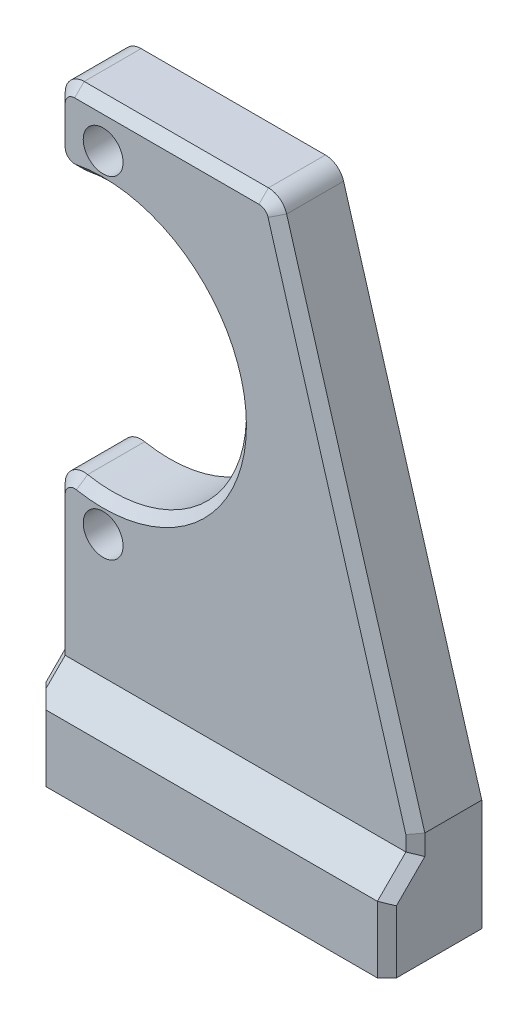
ISO-10303-21;
HEADER;
FILE_DESCRIPTION(('STEP AP214'),'2;1');
FILE_NAME('part.step','',(''),(''),'','','');
FILE_SCHEMA(('AUTOMOTIVE_DESIGN { 1 0 10303 214 1 1 1 1 }'));
ENDSEC;
DATA;
#1=APPLICATION_CONTEXT('core data for automotive mechanical design processes');
#2=APPLICATION_PROTOCOL_DEFINITION('international standard','automotive_design',2000,#1);
#3=PRODUCT_CONTEXT('',#1,'mechanical');
#4=PRODUCT('Part','Part','',(#3));
#5=PRODUCT_RELATED_PRODUCT_CATEGORY('part','',(#4));
#6=PRODUCT_DEFINITION_FORMATION('','',#4);
#7=PRODUCT_DEFINITION_CONTEXT('part definition',#1,'design');
#8=PRODUCT_DEFINITION('design','',#6,#7);
#9=PRODUCT_DEFINITION_SHAPE('','',#8);
#10=(LENGTH_UNIT() NAMED_UNIT(*) SI_UNIT(.MILLI.,.METRE.));
#11=(NAMED_UNIT(*) PLANE_ANGLE_UNIT() SI_UNIT($,.RADIAN.));
#12=(NAMED_UNIT(*) SI_UNIT($,.STERADIAN.) SOLID_ANGLE_UNIT());
#13=UNCERTAINTY_MEASURE_WITH_UNIT(LENGTH_MEASURE(1.E-05),#10,'distance_accuracy_value','');
#14=(GEOMETRIC_REPRESENTATION_CONTEXT(3) GLOBAL_UNCERTAINTY_ASSIGNED_CONTEXT((#13)) GLOBAL_UNIT_ASSIGNED_CONTEXT((#10,
#11,#12)) REPRESENTATION_CONTEXT('',''));
#15=CARTESIAN_POINT('',(0.,0.,0.));
#16=DIRECTION('',(0.,0.,1.));
#17=DIRECTION('',(1.,0.,0.));
#18=AXIS2_PLACEMENT_3D('',#15,#16,#17);
#19=CARTESIAN_POINT('',(-13.0887811558611,62.3706180274269,10.));
#20=DIRECTION('',(0.,-1.,0.));
#21=DIRECTION('',(0.,0.,-1.));
#22=AXIS2_PLACEMENT_3D('',#19,#20,#21);
#23=PLANE('',#22);
#24=DIRECTION('',(0.,0.,-1.));
#25=VECTOR('',#24,1.);
#26=CARTESIAN_POINT('',(-11.0887811558611,62.3706180274269,10.));
#27=LINE('',#26,#25);
#28=CARTESIAN_POINT('',(-11.0887811558611,62.3706180274269,0.));
#29=VERTEX_POINT('',#28);
#30=CARTESIAN_POINT('',(-11.0887811558611,62.3706180274269,6.));
#31=VERTEX_POINT('',#30);
#32=EDGE_CURVE('E238',#29,#31,#27,.F.);
#33=ORIENTED_EDGE('',*,*,#32,.T.);
#34=DIRECTION('',(1.,0.,0.));
#35=VECTOR('',#34,1.);
#36=CARTESIAN_POINT('',(8.33058138017552,62.3706180274269,6.));
#37=LINE('',#36,#35);
#38=CARTESIAN_POINT('',(8.33058138017552,62.3706180274269,6.));
#39=VERTEX_POINT('',#38);
#40=EDGE_CURVE('E303',#31,#39,#37,.T.);
#41=ORIENTED_EDGE('',*,*,#40,.T.);
#42=DIRECTION('',(0.,0.,-1.));
#43=VECTOR('',#42,1.);
#44=CARTESIAN_POINT('',(8.33058138017552,62.3706180274269,10.));
#45=LINE('',#44,#43);
#46=CARTESIAN_POINT('',(8.33058138017552,62.3706180274269,0.));
#47=VERTEX_POINT('',#46);
#48=EDGE_CURVE('E236',#39,#47,#45,.T.);
#49=ORIENTED_EDGE('',*,*,#48,.T.);
#50=DIRECTION('',(-1.,0.,0.));
#51=VECTOR('',#50,1.);
#52=CARTESIAN_POINT('',(-13.0887811558611,62.3706180274269,0.));
#53=LINE('',#52,#51);
#54=EDGE_CURVE('E432',#47,#29,#53,.T.);
#55=ORIENTED_EDGE('',*,*,#54,.T.);
#56=EDGE_LOOP('',(#33,#41,#49,#55));
#57=FACE_BOUND('',#56,.T.);
#58=ADVANCED_FACE('F34',(#57),#23,.F.);
#59=CARTESIAN_POINT('',(-13.0887811558611,53.715647776757,10.));
#60=DIRECTION('',(1.,0.,0.));
#61=DIRECTION('',(0.,1.,0.));
#62=AXIS2_PLACEMENT_3D('',#59,#60,#61);
#63=PLANE('',#62);
#64=DIRECTION('',(0.,0.,-1.));
#65=VECTOR('',#64,1.);
#66=CARTESIAN_POINT('',(-13.0887811558611,56.349973406966,10.));
#67=LINE('',#66,#65);
#68=CARTESIAN_POINT('',(-13.0887811558611,56.349973406966,0.));
#69=VERTEX_POINT('',#68);
#70=CARTESIAN_POINT('',(-13.0887811558611,56.349973406966,6.));
#71=VERTEX_POINT('',#70);
#72=EDGE_CURVE('E223',#69,#71,#67,.F.);
#73=ORIENTED_EDGE('',*,*,#72,.T.);
#74=DIRECTION('',(0.,1.,0.));
#75=VECTOR('',#74,1.);
#76=CARTESIAN_POINT('',(-13.0887811558611,60.3706180274269,6.));
#77=LINE('',#76,#75);
#78=CARTESIAN_POINT('',(-13.0887811558611,60.3706180274269,6.));
#79=VERTEX_POINT('',#78);
#80=EDGE_CURVE('E297',#71,#79,#77,.T.);
#81=ORIENTED_EDGE('',*,*,#80,.T.);
#82=DIRECTION('',(0.,0.,-1.));
#83=VECTOR('',#82,1.);
#84=CARTESIAN_POINT('',(-13.0887811558611,60.3706180274269,10.));
#85=LINE('',#84,#83);
#86=CARTESIAN_POINT('',(-13.0887811558611,60.3706180274269,0.));
#87=VERTEX_POINT('',#86);
#88=EDGE_CURVE('E226',#79,#87,#85,.T.);
#89=ORIENTED_EDGE('',*,*,#88,.T.);
#90=DIRECTION('',(0.,-1.,0.));
#91=VECTOR('',#90,1.);
#92=CARTESIAN_POINT('',(-13.0887811558611,53.715647776757,0.));
#93=LINE('',#92,#91);
#94=EDGE_CURVE('E430',#87,#69,#93,.T.);
#95=ORIENTED_EDGE('',*,*,#94,.T.);
#96=EDGE_LOOP('',(#73,#81,#89,#95));
#97=FACE_BOUND('',#96,.T.);
#98=ADVANCED_FACE('F479',(#97),#63,.F.);
#99=CARTESIAN_POINT('',(-8.08878115586111,40.5319457170168,10.));
#100=DIRECTION('',(0.,0.,-1.));
#101=DIRECTION('',(-1.,0.,0.));
#102=AXIS2_PLACEMENT_3D('',#99,#100,#101);
#103=CYLINDRICAL_SURFACE('',#102,14.1);
#104=DIRECTION('',(0.,0.,-1.));
#105=VECTOR('',#104,1.);
#106=CARTESIAN_POINT('',(-10.7161103484077,26.6788904109122,10.));
#107=LINE('',#106,#105);
#108=CARTESIAN_POINT('',(-10.7161103484077,26.6788904109122,0.));
#109=VERTEX_POINT('',#108);
#110=CARTESIAN_POINT('',(-10.7161103484077,26.6788904109122,6.));
#111=VERTEX_POINT('',#110);
#112=EDGE_CURVE('E244',#109,#111,#107,.F.);
#113=ORIENTED_EDGE('',*,*,#112,.T.);
#114=CARTESIAN_POINT('',(-8.08878115586111,40.5319457170168,6.));
#115=DIRECTION('',(0.,0.,1.));
#116=DIRECTION('',(1.,0.,0.));
#117=AXIS2_PLACEMENT_3D('',#114,#115,#116);
#118=CIRCLE('',#117,14.1);
#119=CARTESIAN_POINT('',(-10.7161103484077,54.3850010231214,6.));
#120=VERTEX_POINT('',#119);
#121=EDGE_CURVE('E291',#111,#120,#118,.T.);
#122=ORIENTED_EDGE('',*,*,#121,.T.);
#123=DIRECTION('',(0.,0.,-1.));
#124=VECTOR('',#123,1.);
#125=CARTESIAN_POINT('',(-10.7161103484077,54.3850010231214,10.));
#126=LINE('',#125,#124);
#127=CARTESIAN_POINT('',(-10.7161103484077,54.3850010231214,0.));
#128=VERTEX_POINT('',#127);
#129=EDGE_CURVE('E247',#120,#128,#126,.T.);
#130=ORIENTED_EDGE('',*,*,#129,.T.);
#131=CARTESIAN_POINT('',(-8.08878115586111,40.5319457170168,0.));
#132=DIRECTION('',(0.,0.,-1.));
#133=DIRECTION('',(1.,0.,0.));
#134=AXIS2_PLACEMENT_3D('',#131,#132,#133);
#135=CIRCLE('',#134,14.1);
#136=EDGE_CURVE('E210',#128,#109,#135,.T.);
#137=ORIENTED_EDGE('',*,*,#136,.T.);
#138=EDGE_LOOP('',(#113,#122,#130,#137));
#139=FACE_BOUND('',#138,.T.);
#140=ADVANCED_FACE('F427',(#139),#103,.F.);
#141=CARTESIAN_POINT('',(-8.08878115586112,58.0319457170168,10.));
#142=DIRECTION('',(0.,0.,-1.));
#143=DIRECTION('',(-1.,0.,0.));
#144=AXIS2_PLACEMENT_3D('',#141,#142,#143);
#145=CYLINDRICAL_SURFACE('',#144,2.1);
#146=CARTESIAN_POINT('',(-8.08878115586112,58.0319457170168,0.));
#147=DIRECTION('',(0.,0.,1.));
#148=DIRECTION('',(-1.,0.,0.));
#149=AXIS2_PLACEMENT_3D('',#146,#147,#148);
#150=CIRCLE('',#149,2.1);
#151=CARTESIAN_POINT('',(-10.1887811558611,58.0319457170168,0.));
#152=VERTEX_POINT('',#151);
#153=EDGE_CURVE('E436',#152,#152,#150,.T.);
#154=ORIENTED_EDGE('',*,*,#153,.F.);
#155=EDGE_LOOP('',(#154));
#156=FACE_BOUND('',#155,.T.);
#157=CARTESIAN_POINT('',(-8.08878115586112,58.0319457170168,7.));
#158=DIRECTION('',(0.,0.,1.));
#159=DIRECTION('',(1.,0.,0.));
#160=AXIS2_PLACEMENT_3D('',#157,#158,#159);
#161=CIRCLE('',#160,2.1);
#162=CARTESIAN_POINT('',(-5.98878115586112,58.0319457170168,7.));
#163=VERTEX_POINT('',#162);
#164=EDGE_CURVE('E219',#163,#163,#161,.T.);
#165=ORIENTED_EDGE('',*,*,#164,.T.);
#166=EDGE_LOOP('',(#165));
#167=FACE_BOUND('',#166,.T.);
#168=ADVANCED_FACE('F540',(#156,#167),#145,.F.);
#169=CARTESIAN_POINT('',(-8.08878115586111,23.0319457170168,10.));
#170=DIRECTION('',(0.,0.,-1.));
#171=DIRECTION('',(-1.,0.,0.));
#172=AXIS2_PLACEMENT_3D('',#169,#170,#171);
#173=CYLINDRICAL_SURFACE('',#172,2.1);
#174=CARTESIAN_POINT('',(-8.08878115586111,23.0319457170168,0.));
#175=DIRECTION('',(0.,0.,1.));
#176=DIRECTION('',(1.,0.,0.));
#177=AXIS2_PLACEMENT_3D('',#174,#175,#176);
#178=CIRCLE('',#177,2.1);
#179=CARTESIAN_POINT('',(-5.98878115586111,23.0319457170168,0.));
#180=VERTEX_POINT('',#179);
#181=EDGE_CURVE('E440',#180,#180,#178,.T.);
#182=ORIENTED_EDGE('',*,*,#181,.F.);
#183=EDGE_LOOP('',(#182));
#184=FACE_BOUND('',#183,.T.);
#185=CARTESIAN_POINT('',(-8.08878115586111,23.0319457170168,7.));
#186=DIRECTION('',(0.,0.,1.));
#187=DIRECTION('',(1.,0.,0.));
#188=AXIS2_PLACEMENT_3D('',#185,#186,#187);
#189=CIRCLE('',#188,2.1);
#190=CARTESIAN_POINT('',(-5.98878115586111,23.0319457170168,7.));
#191=VERTEX_POINT('',#190);
#192=EDGE_CURVE('E216',#191,#191,#189,.T.);
#193=ORIENTED_EDGE('',*,*,#192,.T.);
#194=EDGE_LOOP('',(#193));
#195=FACE_BOUND('',#194,.T.);
#196=ADVANCED_FACE('F537',(#184,#195),#173,.F.);
#197=CARTESIAN_POINT('',(-8.08878115586111,40.5319457170168,10.));
#198=DIRECTION('',(0.,0.,1.));
#199=DIRECTION('',(1.,0.,0.));
#200=AXIS2_PLACEMENT_3D('',#197,#198,#199);
#201=PLANE('',#200);
#202=DIRECTION('',(-1.,0.,0.));
#203=VECTOR('',#202,1.);
#204=CARTESIAN_POINT('',(-13.0887811558611,6.99999999999998,10.));
#205=LINE('',#204,#203);
#206=CARTESIAN_POINT('',(23.8127338897394,6.99999999999998,10.));
#207=VERTEX_POINT('',#206);
#208=CARTESIAN_POINT('',(-11.0887811558611,6.99999999999998,10.));
#209=VERTEX_POINT('',#208);
#210=EDGE_CURVE('E215',#207,#209,#205,.T.);
#211=ORIENTED_EDGE('',*,*,#210,.T.);
#212=DIRECTION('',(0.,-1.,0.));
#213=VECTOR('',#212,1.);
#214=CARTESIAN_POINT('',(-11.0887811558611,0.,10.));
#215=LINE('',#214,#213);
#216=CARTESIAN_POINT('',(-11.0887811558611,0.,10.));
#217=VERTEX_POINT('',#216);
#218=EDGE_CURVE('E305',#209,#217,#215,.T.);
#219=ORIENTED_EDGE('',*,*,#218,.T.);
#220=DIRECTION('',(1.,0.,0.));
#221=VECTOR('',#220,1.);
#222=CARTESIAN_POINT('',(28.2870012815656,0.,10.));
#223=LINE('',#222,#221);
#224=CARTESIAN_POINT('',(23.8127338897394,0.,10.));
#225=VERTEX_POINT('',#224);
#226=EDGE_CURVE('E206',#217,#225,#223,.T.);
#227=ORIENTED_EDGE('',*,*,#226,.T.);
#228=DIRECTION('',(0.,1.,0.));
#229=VECTOR('',#228,1.);
#230=CARTESIAN_POINT('',(23.8127338897394,6.99999999999998,10.));
#231=LINE('',#230,#229);
#232=EDGE_CURVE('E251',#225,#207,#231,.T.);
#233=ORIENTED_EDGE('',*,*,#232,.T.);
#234=EDGE_LOOP('',(#211,#219,#227,#233));
#235=FACE_BOUND('',#234,.T.);
#236=ADVANCED_FACE('F353',(#235),#201,.T.);
#237=CARTESIAN_POINT('',(-8.08878115586111,40.5319457170168,0.));
#238=DIRECTION('',(0.,0.,1.));
#239=DIRECTION('',(1.,0.,0.));
#240=AXIS2_PLACEMENT_3D('',#237,#238,#239);
#241=PLANE('',#240);
#242=ORIENTED_EDGE('',*,*,#94,.F.);
#243=CARTESIAN_POINT('',(-11.0887811558611,60.3706180274269,0.));
#244=DIRECTION('',(0.,0.,1.));
#245=DIRECTION('',(1.,0.,0.));
#246=AXIS2_PLACEMENT_3D('',#243,#244,#245);
#247=CIRCLE('',#246,2.);
#248=EDGE_CURVE('E234',#87,#29,#247,.F.);
#249=ORIENTED_EDGE('',*,*,#248,.T.);
#250=ORIENTED_EDGE('',*,*,#54,.F.);
#251=CARTESIAN_POINT('',(8.33058138017552,60.3706180274269,0.));
#252=DIRECTION('',(0.,0.,1.));
#253=DIRECTION('',(1.,0.,0.));
#254=AXIS2_PLACEMENT_3D('',#251,#252,#253);
#255=CIRCLE('',#254,2.);
#256=CARTESIAN_POINT('',(10.2483242545276,60.9382995119514,0.));
#257=VERTEX_POINT('',#256);
#258=EDGE_CURVE('E232',#47,#257,#255,.F.);
#259=ORIENTED_EDGE('',*,*,#258,.T.);
#260=DIRECTION('',(-0.283840742262227,0.958871437176032,0.));
#261=VECTOR('',#260,1.);
#262=CARTESIAN_POINT('',(24.8127338897394,11.7367779571846,0.));
#263=LINE('',#262,#261);
#264=CARTESIAN_POINT('',(24.8127338897394,11.7367779571846,0.));
#265=VERTEX_POINT('',#264);
#266=EDGE_CURVE('E190',#265,#257,#263,.T.);
#267=ORIENTED_EDGE('',*,*,#266,.F.);
#268=DIRECTION('',(0.,1.,0.));
#269=VECTOR('',#268,1.);
#270=CARTESIAN_POINT('',(24.8127338897394,11.7367779571846,0.));
#271=LINE('',#270,#269);
#272=CARTESIAN_POINT('',(24.8127338897394,0.,0.));
#273=VERTEX_POINT('',#272);
#274=EDGE_CURVE('E181',#273,#265,#271,.T.);
#275=ORIENTED_EDGE('',*,*,#274,.F.);
#276=DIRECTION('',(1.,0.,0.));
#277=VECTOR('',#276,1.);
#278=CARTESIAN_POINT('',(28.2870012815656,0.,0.));
#279=LINE('',#278,#277);
#280=CARTESIAN_POINT('',(-13.0887811558611,0.,0.));
#281=VERTEX_POINT('',#280);
#282=EDGE_CURVE('E198',#281,#273,#279,.T.);
#283=ORIENTED_EDGE('',*,*,#282,.F.);
#284=DIRECTION('',(0.,-1.,0.));
#285=VECTOR('',#284,1.);
#286=CARTESIAN_POINT('',(-13.0887811558611,0.,0.));
#287=LINE('',#286,#285);
#288=CARTESIAN_POINT('',(-13.0887811558611,24.7139180270676,0.));
#289=VERTEX_POINT('',#288);
#290=EDGE_CURVE('E207',#289,#281,#287,.T.);
#291=ORIENTED_EDGE('',*,*,#290,.F.);
#292=CARTESIAN_POINT('',(-11.0887811558611,24.7139180270676,0.));
#293=DIRECTION('',(0.,0.,1.));
#294=DIRECTION('',(1.,0.,0.));
#295=AXIS2_PLACEMENT_3D('',#292,#293,#294);
#296=CIRCLE('',#295,2.);
#297=EDGE_CURVE('E228',#289,#109,#296,.F.);
#298=ORIENTED_EDGE('',*,*,#297,.T.);
#299=ORIENTED_EDGE('',*,*,#136,.F.);
#300=CARTESIAN_POINT('',(-11.0887811558611,56.349973406966,0.));
#301=DIRECTION('',(0.,0.,1.));
#302=DIRECTION('',(1.,0.,0.));
#303=AXIS2_PLACEMENT_3D('',#300,#301,#302);
#304=CIRCLE('',#303,2.);
#305=EDGE_CURVE('E230',#128,#69,#304,.F.);
#306=ORIENTED_EDGE('',*,*,#305,.T.);
#307=EDGE_LOOP('',(#242,#249,#250,#259,#267,#275,#283,#291,#298,#299,#306));
#308=FACE_BOUND('',#307,.T.);
#309=ORIENTED_EDGE('',*,*,#153,.T.);
#310=EDGE_LOOP('',(#309));
#311=FACE_BOUND('',#310,.T.);
#312=ORIENTED_EDGE('',*,*,#181,.T.);
#313=EDGE_LOOP('',(#312));
#314=FACE_BOUND('',#313,.T.);
#315=ADVANCED_FACE('F195',(#308,#311,#314),#241,.F.);
#316=CARTESIAN_POINT('',(-13.0887811558611,0.,10.));
#317=DIRECTION('',(1.,0.,0.));
#318=DIRECTION('',(0.,0.,-1.));
#319=AXIS2_PLACEMENT_3D('',#316,#317,#318);
#320=PLANE('',#319);
#321=DIRECTION('',(0.,0.,-1.));
#322=VECTOR('',#321,1.);
#323=CARTESIAN_POINT('',(-13.0887811558611,0.,10.));
#324=LINE('',#323,#322);
#325=CARTESIAN_POINT('',(-13.0887811558611,0.,7.99999999999998));
#326=VERTEX_POINT('',#325);
#327=EDGE_CURVE('E204',#326,#281,#324,.T.);
#328=ORIENTED_EDGE('',*,*,#327,.F.);
#329=DIRECTION('',(0.,1.,0.));
#330=VECTOR('',#329,1.);
#331=CARTESIAN_POINT('',(-13.0887811558611,5.5857864376269,7.99999999999998));
#332=LINE('',#331,#330);
#333=CARTESIAN_POINT('',(-13.0887811558611,7.58578643762693,7.99999999999998));
#334=VERTEX_POINT('',#333);
#335=EDGE_CURVE('E56',#326,#334,#332,.T.);
#336=ORIENTED_EDGE('',*,*,#335,.T.);
#337=DIRECTION('',(0.,0.707106781186549,-0.707106781186546));
#338=VECTOR('',#337,1.);
#339=CARTESIAN_POINT('',(-13.0887811558611,9.29289321881346,6.29289321881346));
#340=LINE('',#339,#338);
#341=CARTESIAN_POINT('',(-13.0887811558611,9.58578643762693,6.));
#342=VERTEX_POINT('',#341);
#343=EDGE_CURVE('E287',#334,#342,#340,.T.);
#344=ORIENTED_EDGE('',*,*,#343,.T.);
#345=DIRECTION('',(0.,1.,0.));
#346=VECTOR('',#345,1.);
#347=CARTESIAN_POINT('',(-13.0887811558611,24.7139180270676,6.));
#348=LINE('',#347,#346);
#349=CARTESIAN_POINT('',(-13.0887811558611,24.7139180270676,6.));
#350=VERTEX_POINT('',#349);
#351=EDGE_CURVE('E285',#342,#350,#348,.T.);
#352=ORIENTED_EDGE('',*,*,#351,.T.);
#353=DIRECTION('',(0.,0.,-1.));
#354=VECTOR('',#353,1.);
#355=CARTESIAN_POINT('',(-13.0887811558611,24.7139180270676,10.));
#356=LINE('',#355,#354);
#357=EDGE_CURVE('E249',#350,#289,#356,.T.);
#358=ORIENTED_EDGE('',*,*,#357,.T.);
#359=ORIENTED_EDGE('',*,*,#290,.T.);
#360=EDGE_LOOP('',(#328,#336,#344,#352,#358,#359));
#361=FACE_BOUND('',#360,.T.);
#362=ADVANCED_FACE('F346',(#361),#320,.F.);
#363=CARTESIAN_POINT('',(28.2870012815656,0.,10.));
#364=DIRECTION('',(0.,1.,0.));
#365=DIRECTION('',(-1.,0.,0.));
#366=AXIS2_PLACEMENT_3D('',#363,#364,#365);
#367=PLANE('',#366);
#368=CARTESIAN_POINT('',(6.18,0.,5.));
#369=DIRECTION('',(0.,-1.,0.));
#370=DIRECTION('',(1.,0.,0.));
#371=AXIS2_PLACEMENT_3D('',#368,#369,#370);
#372=CIRCLE('',#371,1.5);
#373=CARTESIAN_POINT('',(7.68,0.,5.));
#374=VERTEX_POINT('',#373);
#375=EDGE_CURVE('E456',#374,#374,#372,.T.);
#376=ORIENTED_EDGE('',*,*,#375,.F.);
#377=EDGE_LOOP('',(#376));
#378=FACE_BOUND('',#377,.T.);
#379=CARTESIAN_POINT('',(19.36,0.,5.));
#380=DIRECTION('',(0.,-1.,0.));
#381=DIRECTION('',(1.,0.,0.));
#382=AXIS2_PLACEMENT_3D('',#379,#380,#381);
#383=CIRCLE('',#382,1.5);
#384=CARTESIAN_POINT('',(20.86,0.,5.));
#385=VERTEX_POINT('',#384);
#386=EDGE_CURVE('E450',#385,#385,#383,.T.);
#387=ORIENTED_EDGE('',*,*,#386,.F.);
#388=EDGE_LOOP('',(#387));
#389=FACE_BOUND('',#388,.T.);
#390=CARTESIAN_POINT('',(-7.,0.,5.));
#391=DIRECTION('',(0.,-1.,0.));
#392=DIRECTION('',(1.,0.,0.));
#393=AXIS2_PLACEMENT_3D('',#390,#391,#392);
#394=CIRCLE('',#393,1.5);
#395=CARTESIAN_POINT('',(-5.5,0.,5.));
#396=VERTEX_POINT('',#395);
#397=EDGE_CURVE('E444',#396,#396,#394,.T.);
#398=ORIENTED_EDGE('',*,*,#397,.F.);
#399=EDGE_LOOP('',(#398));
#400=FACE_BOUND('',#399,.T.);
#401=ORIENTED_EDGE('',*,*,#226,.F.);
#402=DIRECTION('',(-0.707106781186546,0.,-0.707106781186549));
#403=VECTOR('',#402,1.);
#404=CARTESIAN_POINT('',(-11.0887811558611,0.,10.));
#405=LINE('',#404,#403);
#406=EDGE_CURVE('E342',#217,#326,#405,.T.);
#407=ORIENTED_EDGE('',*,*,#406,.T.);
#408=ORIENTED_EDGE('',*,*,#327,.T.);
#409=ORIENTED_EDGE('',*,*,#282,.T.);
#410=DIRECTION('',(0.,0.,-1.));
#411=VECTOR('',#410,1.);
#412=CARTESIAN_POINT('',(24.8127338897394,0.,10.));
#413=LINE('',#412,#411);
#414=CARTESIAN_POINT('',(24.8127338897394,0.,9.00000000000001));
#415=VERTEX_POINT('',#414);
#416=EDGE_CURVE('E177',#415,#273,#413,.T.);
#417=ORIENTED_EDGE('',*,*,#416,.F.);
#418=DIRECTION('',(-0.707106781186548,0.,0.707106781186547));
#419=VECTOR('',#418,1.);
#420=CARTESIAN_POINT('',(23.8127338897394,0.,10.));
#421=LINE('',#420,#419);
#422=EDGE_CURVE('E259',#415,#225,#421,.T.);
#423=ORIENTED_EDGE('',*,*,#422,.T.);
#424=EDGE_LOOP('',(#401,#407,#408,#409,#417,#423));
#425=FACE_BOUND('',#424,.T.);
#426=ADVANCED_FACE('F203',(#378,#389,#400,#425),#367,.F.);
#427=CARTESIAN_POINT('',(-7.,8.,5.));
#428=DIRECTION('',(0.,-1.,0.));
#429=DIRECTION('',(1.,0.,0.));
#430=AXIS2_PLACEMENT_3D('',#427,#428,#429);
#431=CYLINDRICAL_SURFACE('',#430,1.5);
#432=CARTESIAN_POINT('',(-7.,8.,5.));
#433=DIRECTION('',(0.,-1.,0.));
#434=DIRECTION('',(1.,0.,0.));
#435=AXIS2_PLACEMENT_3D('',#432,#433,#434);
#436=CIRCLE('',#435,1.5);
#437=CARTESIAN_POINT('',(-5.5,8.,5.));
#438=VERTEX_POINT('',#437);
#439=EDGE_CURVE('E443',#438,#438,#436,.T.);
#440=ORIENTED_EDGE('',*,*,#439,.F.);
#441=EDGE_LOOP('',(#440));
#442=FACE_BOUND('',#441,.T.);
#443=ORIENTED_EDGE('',*,*,#397,.T.);
#444=EDGE_LOOP('',(#443));
#445=FACE_BOUND('',#444,.T.);
#446=ADVANCED_FACE('F532',(#442,#445),#431,.F.);
#447=CARTESIAN_POINT('',(-7.,8.,5.));
#448=DIRECTION('',(0.,-1.,0.));
#449=DIRECTION('',(1.,0.,0.));
#450=AXIS2_PLACEMENT_3D('',#447,#448,#449);
#451=PLANE('',#450);
#452=ORIENTED_EDGE('',*,*,#439,.T.);
#453=EDGE_LOOP('',(#452));
#454=FACE_BOUND('',#453,.T.);
#455=ADVANCED_FACE('F528',(#454),#451,.T.);
#456=CARTESIAN_POINT('',(19.36,8.,5.));
#457=DIRECTION('',(0.,-1.,0.));
#458=DIRECTION('',(1.,0.,0.));
#459=AXIS2_PLACEMENT_3D('',#456,#457,#458);
#460=CYLINDRICAL_SURFACE('',#459,1.5);
#461=CARTESIAN_POINT('',(19.36,8.,5.));
#462=DIRECTION('',(0.,-1.,0.));
#463=DIRECTION('',(1.,0.,0.));
#464=AXIS2_PLACEMENT_3D('',#461,#462,#463);
#465=CIRCLE('',#464,1.5);
#466=CARTESIAN_POINT('',(20.86,8.,5.));
#467=VERTEX_POINT('',#466);
#468=EDGE_CURVE('E453',#467,#467,#465,.T.);
#469=ORIENTED_EDGE('',*,*,#468,.F.);
#470=EDGE_LOOP('',(#469));
#471=FACE_BOUND('',#470,.T.);
#472=ORIENTED_EDGE('',*,*,#386,.T.);
#473=EDGE_LOOP('',(#472));
#474=FACE_BOUND('',#473,.T.);
#475=ADVANCED_FACE('F524',(#471,#474),#460,.F.);
#476=CARTESIAN_POINT('',(19.36,8.,5.));
#477=DIRECTION('',(0.,-1.,0.));
#478=DIRECTION('',(1.,0.,0.));
#479=AXIS2_PLACEMENT_3D('',#476,#477,#478);
#480=PLANE('',#479);
#481=ORIENTED_EDGE('',*,*,#468,.T.);
#482=EDGE_LOOP('',(#481));
#483=FACE_BOUND('',#482,.T.);
#484=ADVANCED_FACE('F520',(#483),#480,.T.);
#485=CARTESIAN_POINT('',(6.18,8.,5.));
#486=DIRECTION('',(0.,-1.,0.));
#487=DIRECTION('',(1.,0.,0.));
#488=AXIS2_PLACEMENT_3D('',#485,#486,#487);
#489=CYLINDRICAL_SURFACE('',#488,1.5);
#490=CARTESIAN_POINT('',(6.18,8.,5.));
#491=DIRECTION('',(0.,-1.,0.));
#492=DIRECTION('',(1.,0.,0.));
#493=AXIS2_PLACEMENT_3D('',#490,#491,#492);
#494=CIRCLE('',#493,1.5);
#495=CARTESIAN_POINT('',(7.68,8.,5.));
#496=VERTEX_POINT('',#495);
#497=EDGE_CURVE('E447',#496,#496,#494,.T.);
#498=ORIENTED_EDGE('',*,*,#497,.F.);
#499=EDGE_LOOP('',(#498));
#500=FACE_BOUND('',#499,.T.);
#501=ORIENTED_EDGE('',*,*,#375,.T.);
#502=EDGE_LOOP('',(#501));
#503=FACE_BOUND('',#502,.T.);
#504=ADVANCED_FACE('F516',(#500,#503),#489,.F.);
#505=CARTESIAN_POINT('',(6.18,8.,5.));
#506=DIRECTION('',(0.,-1.,0.));
#507=DIRECTION('',(1.,0.,0.));
#508=AXIS2_PLACEMENT_3D('',#505,#506,#507);
#509=PLANE('',#508);
#510=ORIENTED_EDGE('',*,*,#497,.T.);
#511=EDGE_LOOP('',(#510));
#512=FACE_BOUND('',#511,.T.);
#513=ADVANCED_FACE('F513',(#512),#509,.T.);
#514=CARTESIAN_POINT('',(0.,0.,7.));
#515=DIRECTION('',(0.,0.,1.));
#516=DIRECTION('',(1.,0.,0.));
#517=AXIS2_PLACEMENT_3D('',#514,#515,#516);
#518=PLANE('',#517);
#519=DIRECTION('',(1.,0.,0.));
#520=VECTOR('',#519,1.);
#521=CARTESIAN_POINT('',(-15.0951683588392,9.99999999999999,7.));
#522=LINE('',#521,#520);
#523=CARTESIAN_POINT('',(-12.0887811558611,9.99999999999999,7.));
#524=VERTEX_POINT('',#523);
#525=CARTESIAN_POINT('',(23.8127338897394,9.99999999999999,7.));
#526=VERTEX_POINT('',#525);
#527=EDGE_CURVE('E220',#524,#526,#522,.T.);
#528=ORIENTED_EDGE('',*,*,#527,.T.);
#529=DIRECTION('',(0.,1.,0.));
#530=VECTOR('',#529,1.);
#531=CARTESIAN_POINT('',(23.8127338897394,11.7367779571846,7.));
#532=LINE('',#531,#530);
#533=CARTESIAN_POINT('',(23.8127338897394,11.5918778188318,7.));
#534=VERTEX_POINT('',#533);
#535=EDGE_CURVE('E283',#526,#534,#532,.T.);
#536=ORIENTED_EDGE('',*,*,#535,.T.);
#537=DIRECTION('',(-0.283840742262227,0.958871437176032,0.));
#538=VECTOR('',#537,1.);
#539=CARTESIAN_POINT('',(9.28945281735155,60.6544587696892,7.));
#540=LINE('',#539,#538);
#541=CARTESIAN_POINT('',(9.28945281735156,60.6544587696892,7.));
#542=VERTEX_POINT('',#541);
#543=EDGE_CURVE('E273',#534,#542,#540,.T.);
#544=ORIENTED_EDGE('',*,*,#543,.T.);
#545=CARTESIAN_POINT('',(8.33058138017552,60.3706180274269,7.));
#546=DIRECTION('',(0.,0.,1.));
#547=DIRECTION('',(1.,0.,0.));
#548=AXIS2_PLACEMENT_3D('',#545,#546,#547);
#549=CIRCLE('',#548,1.00000000000001);
#550=CARTESIAN_POINT('',(8.33058138017552,61.3706180274269,7.));
#551=VERTEX_POINT('',#550);
#552=EDGE_CURVE('E269',#542,#551,#549,.T.);
#553=ORIENTED_EDGE('',*,*,#552,.T.);
#554=DIRECTION('',(-1.,0.,0.));
#555=VECTOR('',#554,1.);
#556=CARTESIAN_POINT('',(-11.0887811558611,61.3706180274269,7.));
#557=LINE('',#556,#555);
#558=CARTESIAN_POINT('',(-11.0887811558611,61.3706180274269,7.));
#559=VERTEX_POINT('',#558);
#560=EDGE_CURVE('E265',#551,#559,#557,.T.);
#561=ORIENTED_EDGE('',*,*,#560,.T.);
#562=CARTESIAN_POINT('',(-11.0887811558611,60.3706180274269,7.));
#563=DIRECTION('',(0.,0.,1.));
#564=DIRECTION('',(1.,0.,0.));
#565=AXIS2_PLACEMENT_3D('',#562,#563,#564);
#566=CIRCLE('',#565,1.00000000000001);
#567=CARTESIAN_POINT('',(-12.0887811558611,60.3706180274269,7.));
#568=VERTEX_POINT('',#567);
#569=EDGE_CURVE('E267',#559,#568,#566,.T.);
#570=ORIENTED_EDGE('',*,*,#569,.T.);
#571=DIRECTION('',(0.,-1.,0.));
#572=VECTOR('',#571,1.);
#573=CARTESIAN_POINT('',(-12.0887811558611,56.349973406966,7.));
#574=LINE('',#573,#572);
#575=CARTESIAN_POINT('',(-12.0887811558611,56.349973406966,7.));
#576=VERTEX_POINT('',#575);
#577=EDGE_CURVE('E271',#568,#576,#574,.T.);
#578=ORIENTED_EDGE('',*,*,#577,.T.);
#579=CARTESIAN_POINT('',(-11.0887811558611,56.349973406966,7.));
#580=DIRECTION('',(0.,0.,1.));
#581=DIRECTION('',(1.,0.,0.));
#582=AXIS2_PLACEMENT_3D('',#579,#580,#581);
#583=CIRCLE('',#582,1.);
#584=CARTESIAN_POINT('',(-10.9024457521344,55.3674872150437,7.));
#585=VERTEX_POINT('',#584);
#586=EDGE_CURVE('E275',#576,#585,#583,.T.);
#587=ORIENTED_EDGE('',*,*,#586,.T.);
#588=CARTESIAN_POINT('',(-8.08878115586111,40.5319457170168,7.));
#589=DIRECTION('',(0.,0.,1.));
#590=DIRECTION('',(1.,0.,0.));
#591=AXIS2_PLACEMENT_3D('',#588,#589,#590);
#592=CIRCLE('',#591,15.1);
#593=CARTESIAN_POINT('',(-10.9024457521344,25.6964042189899,7.));
#594=VERTEX_POINT('',#593);
#595=EDGE_CURVE('E277',#585,#594,#592,.F.);
#596=ORIENTED_EDGE('',*,*,#595,.T.);
#597=CARTESIAN_POINT('',(-11.0887811558611,24.7139180270676,7.));
#598=DIRECTION('',(0.,0.,1.));
#599=DIRECTION('',(1.,0.,0.));
#600=AXIS2_PLACEMENT_3D('',#597,#598,#599);
#601=CIRCLE('',#600,1.);
#602=CARTESIAN_POINT('',(-12.0887811558611,24.7139180270676,7.));
#603=VERTEX_POINT('',#602);
#604=EDGE_CURVE('E279',#594,#603,#601,.T.);
#605=ORIENTED_EDGE('',*,*,#604,.T.);
#606=DIRECTION('',(0.,-1.,0.));
#607=VECTOR('',#606,1.);
#608=CARTESIAN_POINT('',(-12.0887811558611,9.99999999999999,7.));
#609=LINE('',#608,#607);
#610=EDGE_CURVE('E281',#603,#524,#609,.T.);
#611=ORIENTED_EDGE('',*,*,#610,.T.);
#612=EDGE_LOOP('',(#528,#536,#544,#553,#561,#570,#578,#587,#596,#605,#611));
#613=FACE_BOUND('',#612,.T.);
#614=ORIENTED_EDGE('',*,*,#192,.F.);
#615=EDGE_LOOP('',(#614));
#616=FACE_BOUND('',#615,.T.);
#617=ORIENTED_EDGE('',*,*,#164,.F.);
#618=EDGE_LOOP('',(#617));
#619=FACE_BOUND('',#618,.T.);
#620=ADVANCED_FACE('F366',(#613,#616,#619),#518,.T.);
#621=CARTESIAN_POINT('',(-15.0951683588392,9.99999999999999,7.));
#622=DIRECTION('',(0.,0.707106781186546,0.707106781186549));
#623=DIRECTION('',(-1.,0.,0.));
#624=AXIS2_PLACEMENT_3D('',#621,#622,#623);
#625=PLANE('',#624);
#626=DIRECTION('',(0.,-0.707106781186549,0.707106781186546));
#627=VECTOR('',#626,1.);
#628=CARTESIAN_POINT('',(-12.0887811558611,6.99999999999998,10.));
#629=LINE('',#628,#627);
#630=CARTESIAN_POINT('',(-12.0887811558611,8.00000000000001,8.99999999999998));
#631=VERTEX_POINT('',#630);
#632=EDGE_CURVE('E261',#524,#631,#629,.T.);
#633=ORIENTED_EDGE('',*,*,#632,.T.);
#634=DIRECTION('',(0.577350269189624,-0.577350269189628,0.577350269189626));
#635=VECTOR('',#634,1.);
#636=CARTESIAN_POINT('',(-14.4242435568538,10.3354624009927,6.66453759900729));
#637=LINE('',#636,#635);
#638=EDGE_CURVE('E11',#631,#209,#637,.T.);
#639=ORIENTED_EDGE('',*,*,#638,.T.);
#640=ORIENTED_EDGE('',*,*,#210,.F.);
#641=DIRECTION('',(0.,0.707106781186549,-0.707106781186546));
#642=VECTOR('',#641,1.);
#643=CARTESIAN_POINT('',(23.8127338897394,9.99999999999999,7.));
#644=LINE('',#643,#642);
#645=EDGE_CURVE('E263',#207,#526,#644,.T.);
#646=ORIENTED_EDGE('',*,*,#645,.T.);
#647=ORIENTED_EDGE('',*,*,#527,.F.);
#648=EDGE_LOOP('',(#633,#639,#640,#646,#647));
#649=FACE_BOUND('',#648,.T.);
#650=ADVANCED_FACE('F350',(#649),#625,.T.);
#651=CARTESIAN_POINT('',(24.8127338897394,11.7367779571846,10.));
#652=DIRECTION('',(-0.958871437176032,-0.283840742262227,0.));
#653=DIRECTION('',(0.283840742262227,-0.958871437176032,0.));
#654=AXIS2_PLACEMENT_3D('',#651,#652,#653);
#655=PLANE('',#654);
#656=DIRECTION('',(0.,0.,-1.));
#657=VECTOR('',#656,1.);
#658=CARTESIAN_POINT('',(10.2483242545276,60.9382995119514,10.));
#659=LINE('',#658,#657);
#660=CARTESIAN_POINT('',(10.2483242545276,60.9382995119514,6.));
#661=VERTEX_POINT('',#660);
#662=EDGE_CURVE('E241',#257,#661,#659,.F.);
#663=ORIENTED_EDGE('',*,*,#662,.T.);
#664=DIRECTION('',(0.283840742262227,-0.958871437176032,0.));
#665=VECTOR('',#664,1.);
#666=CARTESIAN_POINT('',(24.8127338897394,11.7367779571846,6.));
#667=LINE('',#666,#665);
#668=CARTESIAN_POINT('',(24.8127338897394,11.7367779571846,6.));
#669=VERTEX_POINT('',#668);
#670=EDGE_CURVE('E295',#661,#669,#667,.T.);
#671=ORIENTED_EDGE('',*,*,#670,.T.);
#672=DIRECTION('',(0.,0.,-1.));
#673=VECTOR('',#672,1.);
#674=CARTESIAN_POINT('',(24.8127338897394,11.7367779571846,10.));
#675=LINE('',#674,#673);
#676=EDGE_CURVE('E189',#669,#265,#675,.T.);
#677=ORIENTED_EDGE('',*,*,#676,.T.);
#678=ORIENTED_EDGE('',*,*,#266,.T.);
#679=EDGE_LOOP('',(#663,#671,#677,#678));
#680=FACE_BOUND('',#679,.T.);
#681=ADVANCED_FACE('F466',(#680),#655,.F.);
#682=CARTESIAN_POINT('',(24.8127338897394,11.7367779571846,10.));
#683=DIRECTION('',(-1.,0.,0.));
#684=DIRECTION('',(0.,-1.,0.));
#685=AXIS2_PLACEMENT_3D('',#682,#683,#684);
#686=PLANE('',#685);
#687=DIRECTION('',(0.,-0.707106781186549,0.707106781186546));
#688=VECTOR('',#687,1.);
#689=CARTESIAN_POINT('',(24.8127338897394,6.29289321881344,9.29289321881345));
#690=LINE('',#689,#688);
#691=CARTESIAN_POINT('',(24.8127338897394,9.5857864376269,6.00000000000001));
#692=VERTEX_POINT('',#691);
#693=CARTESIAN_POINT('',(24.8127338897394,6.58578643762689,9.00000000000001));
#694=VERTEX_POINT('',#693);
#695=EDGE_CURVE('E256',#692,#694,#690,.T.);
#696=ORIENTED_EDGE('',*,*,#695,.T.);
#697=DIRECTION('',(0.,-1.,0.));
#698=VECTOR('',#697,1.);
#699=CARTESIAN_POINT('',(24.8127338897394,0.,9.00000000000001));
#700=LINE('',#699,#698);
#701=EDGE_CURVE('E184',#694,#415,#700,.T.);
#702=ORIENTED_EDGE('',*,*,#701,.T.);
#703=ORIENTED_EDGE('',*,*,#416,.T.);
#704=ORIENTED_EDGE('',*,*,#274,.T.);
#705=ORIENTED_EDGE('',*,*,#676,.F.);
#706=DIRECTION('',(0.,-1.,0.));
#707=VECTOR('',#706,1.);
#708=CARTESIAN_POINT('',(24.8127338897394,9.99999999999999,6.00000000000001));
#709=LINE('',#708,#707);
#710=EDGE_CURVE('E254',#669,#692,#709,.T.);
#711=ORIENTED_EDGE('',*,*,#710,.T.);
#712=EDGE_LOOP('',(#696,#702,#703,#704,#705,#711));
#713=FACE_BOUND('',#712,.T.);
#714=ADVANCED_FACE('F179',(#713),#686,.F.);
#715=CARTESIAN_POINT('',(-11.0887811558611,60.3706180274269,10.));
#716=DIRECTION('',(0.,0.,-1.));
#717=DIRECTION('',(-1.,0.,0.));
#718=AXIS2_PLACEMENT_3D('',#715,#716,#717);
#719=CYLINDRICAL_SURFACE('',#718,2.);
#720=ORIENTED_EDGE('',*,*,#88,.F.);
#721=CARTESIAN_POINT('',(-11.0887811558611,60.3706180274269,6.));
#722=DIRECTION('',(0.,0.,1.));
#723=DIRECTION('',(1.,0.,0.));
#724=AXIS2_PLACEMENT_3D('',#721,#722,#723);
#725=CIRCLE('',#724,2.);
#726=EDGE_CURVE('E301',#79,#31,#725,.F.);
#727=ORIENTED_EDGE('',*,*,#726,.T.);
#728=ORIENTED_EDGE('',*,*,#32,.F.);
#729=ORIENTED_EDGE('',*,*,#248,.F.);
#730=EDGE_LOOP('',(#720,#727,#728,#729));
#731=FACE_BOUND('',#730,.T.);
#732=ADVANCED_FACE('F477',(#731),#719,.T.);
#733=CARTESIAN_POINT('',(8.33058138017552,60.3706180274269,10.));
#734=DIRECTION('',(0.,0.,-1.));
#735=DIRECTION('',(-1.,0.,0.));
#736=AXIS2_PLACEMENT_3D('',#733,#734,#735);
#737=CYLINDRICAL_SURFACE('',#736,2.);
#738=ORIENTED_EDGE('',*,*,#48,.F.);
#739=CARTESIAN_POINT('',(8.33058138017552,60.3706180274269,6.));
#740=DIRECTION('',(0.,0.,1.));
#741=DIRECTION('',(1.,0.,0.));
#742=AXIS2_PLACEMENT_3D('',#739,#740,#741);
#743=CIRCLE('',#742,2.);
#744=EDGE_CURVE('E299',#39,#661,#743,.F.);
#745=ORIENTED_EDGE('',*,*,#744,.T.);
#746=ORIENTED_EDGE('',*,*,#662,.F.);
#747=ORIENTED_EDGE('',*,*,#258,.F.);
#748=EDGE_LOOP('',(#738,#745,#746,#747));
#749=FACE_BOUND('',#748,.T.);
#750=ADVANCED_FACE('F470',(#749),#737,.T.);
#751=CARTESIAN_POINT('',(-11.0887811558611,56.349973406966,10.));
#752=DIRECTION('',(0.,0.,-1.));
#753=DIRECTION('',(-1.,0.,0.));
#754=AXIS2_PLACEMENT_3D('',#751,#752,#753);
#755=CYLINDRICAL_SURFACE('',#754,2.);
#756=ORIENTED_EDGE('',*,*,#129,.F.);
#757=CARTESIAN_POINT('',(-11.0887811558611,56.349973406966,6.));
#758=DIRECTION('',(0.,0.,1.));
#759=DIRECTION('',(1.,0.,0.));
#760=AXIS2_PLACEMENT_3D('',#757,#758,#759);
#761=CIRCLE('',#760,2.);
#762=EDGE_CURVE('E293',#120,#71,#761,.F.);
#763=ORIENTED_EDGE('',*,*,#762,.T.);
#764=ORIENTED_EDGE('',*,*,#72,.F.);
#765=ORIENTED_EDGE('',*,*,#305,.F.);
#766=EDGE_LOOP('',(#756,#763,#764,#765));
#767=FACE_BOUND('',#766,.T.);
#768=ADVANCED_FACE('F482',(#767),#755,.T.);
#769=CARTESIAN_POINT('',(-11.0887811558611,24.7139180270676,10.));
#770=DIRECTION('',(0.,0.,-1.));
#771=DIRECTION('',(-1.,0.,0.));
#772=AXIS2_PLACEMENT_3D('',#769,#770,#771);
#773=CYLINDRICAL_SURFACE('',#772,2.);
#774=ORIENTED_EDGE('',*,*,#357,.F.);
#775=CARTESIAN_POINT('',(-11.0887811558611,24.7139180270676,6.));
#776=DIRECTION('',(0.,0.,1.));
#777=DIRECTION('',(1.,0.,0.));
#778=AXIS2_PLACEMENT_3D('',#775,#776,#777);
#779=CIRCLE('',#778,2.);
#780=EDGE_CURVE('E289',#350,#111,#779,.F.);
#781=ORIENTED_EDGE('',*,*,#780,.T.);
#782=ORIENTED_EDGE('',*,*,#112,.F.);
#783=ORIENTED_EDGE('',*,*,#297,.F.);
#784=EDGE_LOOP('',(#774,#781,#782,#783));
#785=FACE_BOUND('',#784,.T.);
#786=ADVANCED_FACE('F422',(#785),#773,.T.);
#787=CARTESIAN_POINT('',(-13.0887811558611,2.79289321881344,12.7928932188135));
#788=DIRECTION('',(-0.707106781186545,0.5,0.500000000000003));
#789=DIRECTION('',(0.,-0.707106781186549,0.707106781186546));
#790=AXIS2_PLACEMENT_3D('',#787,#788,#789);
#791=PLANE('',#790);
#792=ORIENTED_EDGE('',*,*,#343,.F.);
#793=DIRECTION('',(0.678598344545848,0.281084637714812,0.67859834454585));
#794=VECTOR('',#793,1.);
#795=CARTESIAN_POINT('',(-11.7958879370476,8.12132034355967,9.29289321881348));
#796=LINE('',#795,#794);
#797=EDGE_CURVE('E42',#334,#631,#796,.T.);
#798=ORIENTED_EDGE('',*,*,#797,.T.);
#799=ORIENTED_EDGE('',*,*,#632,.F.);
#800=DIRECTION('',(0.678598344545847,0.281084637714809,0.678598344545852));
#801=VECTOR('',#800,1.);
#802=CARTESIAN_POINT('',(-11.256383650268,10.3447903361022,7.83239750559317));
#803=LINE('',#802,#801);
#804=EDGE_CURVE('E200',#342,#524,#803,.T.);
#805=ORIENTED_EDGE('',*,*,#804,.F.);
#806=EDGE_LOOP('',(#792,#798,#799,#805));
#807=FACE_BOUND('',#806,.T.);
#808=ADVANCED_FACE('F418',(#807),#791,.T.);
#809=CARTESIAN_POINT('',(-12.0887811558611,0.,7.));
#810=DIRECTION('',(-0.70710678118655,0.,0.707106781186545));
#811=DIRECTION('',(0.,1.,0.));
#812=AXIS2_PLACEMENT_3D('',#809,#810,#811);
#813=PLANE('',#812);
#814=ORIENTED_EDGE('',*,*,#804,.T.);
#815=ORIENTED_EDGE('',*,*,#610,.F.);
#816=DIRECTION('',(0.707106781186545,0.,0.70710678118655));
#817=VECTOR('',#816,1.);
#818=CARTESIAN_POINT('',(-13.0887811558611,24.7139180270676,6.));
#819=LINE('',#818,#817);
#820=EDGE_CURVE('E335',#350,#603,#819,.T.);
#821=ORIENTED_EDGE('',*,*,#820,.F.);
#822=ORIENTED_EDGE('',*,*,#351,.F.);
#823=EDGE_LOOP('',(#814,#815,#821,#822));
#824=FACE_BOUND('',#823,.T.);
#825=ADVANCED_FACE('F416',(#824),#813,.T.);
#826=CARTESIAN_POINT('',(-11.0887811558611,24.7139180270676,7.));
#827=DIRECTION('',(0.,0.,-1.));
#828=DIRECTION('',(-1.,0.,0.));
#829=AXIS2_PLACEMENT_3D('',#826,#827,#828);
#830=CONICAL_SURFACE('',#829,1.,0.785398163397446);
#831=ORIENTED_EDGE('',*,*,#820,.T.);
#832=ORIENTED_EDGE('',*,*,#604,.F.);
#833=DIRECTION('',(-0.131759027550288,-0.694722648730412,0.70710678118655));
#834=VECTOR('',#833,1.);
#835=CARTESIAN_POINT('',(-10.7161103484077,26.6788904109122,6.));
#836=LINE('',#835,#834);
#837=EDGE_CURVE('E332',#111,#594,#836,.T.);
#838=ORIENTED_EDGE('',*,*,#837,.F.);
#839=ORIENTED_EDGE('',*,*,#780,.F.);
#840=EDGE_LOOP('',(#831,#832,#838,#839));
#841=FACE_BOUND('',#840,.T.);
#842=ADVANCED_FACE('F411',(#841),#830,.T.);
#843=CARTESIAN_POINT('',(-8.08878115586111,40.5319457170168,7.));
#844=DIRECTION('',(0.,0.,1.));
#845=DIRECTION('',(1.,0.,0.));
#846=AXIS2_PLACEMENT_3D('',#843,#844,#845);
#847=CONICAL_SURFACE('',#846,15.1,0.785398163397445);
#848=ORIENTED_EDGE('',*,*,#837,.T.);
#849=ORIENTED_EDGE('',*,*,#595,.F.);
#850=DIRECTION('',(-0.131759027550289,0.694722648730411,0.707106781186551));
#851=VECTOR('',#850,1.);
#852=CARTESIAN_POINT('',(-10.7161103484077,54.3850010231214,6.));
#853=LINE('',#852,#851);
#854=EDGE_CURVE('E329',#120,#585,#853,.T.);
#855=ORIENTED_EDGE('',*,*,#854,.F.);
#856=ORIENTED_EDGE('',*,*,#121,.F.);
#857=EDGE_LOOP('',(#848,#849,#855,#856));
#858=FACE_BOUND('',#857,.T.);
#859=ADVANCED_FACE('F407',(#858),#847,.F.);
#860=CARTESIAN_POINT('',(-11.0887811558611,56.349973406966,7.));
#861=DIRECTION('',(0.,0.,-1.));
#862=DIRECTION('',(-1.,0.,0.));
#863=AXIS2_PLACEMENT_3D('',#860,#861,#862);
#864=CONICAL_SURFACE('',#863,1.00000000000001,0.785398163397445);
#865=ORIENTED_EDGE('',*,*,#854,.T.);
#866=ORIENTED_EDGE('',*,*,#586,.F.);
#867=DIRECTION('',(0.707106781186546,0.,0.707106781186549));
#868=VECTOR('',#867,1.);
#869=CARTESIAN_POINT('',(-13.0887811558611,56.349973406966,6.));
#870=LINE('',#869,#868);
#871=EDGE_CURVE('E326',#71,#576,#870,.T.);
#872=ORIENTED_EDGE('',*,*,#871,.F.);
#873=ORIENTED_EDGE('',*,*,#762,.F.);
#874=EDGE_LOOP('',(#865,#866,#872,#873));
#875=FACE_BOUND('',#874,.T.);
#876=ADVANCED_FACE('F402',(#875),#864,.T.);
#877=CARTESIAN_POINT('',(-12.0887811558612,0.,7.));
#878=DIRECTION('',(-0.70710678118655,0.,0.707106781186545));
#879=DIRECTION('',(0.,1.,0.));
#880=AXIS2_PLACEMENT_3D('',#877,#878,#879);
#881=PLANE('',#880);
#882=ORIENTED_EDGE('',*,*,#871,.T.);
#883=ORIENTED_EDGE('',*,*,#577,.F.);
#884=DIRECTION('',(0.707106781186545,0.,0.70710678118655));
#885=VECTOR('',#884,1.);
#886=CARTESIAN_POINT('',(-13.0887811558611,60.3706180274269,6.));
#887=LINE('',#886,#885);
#888=EDGE_CURVE('E323',#79,#568,#887,.T.);
#889=ORIENTED_EDGE('',*,*,#888,.F.);
#890=ORIENTED_EDGE('',*,*,#80,.F.);
#891=EDGE_LOOP('',(#882,#883,#889,#890));
#892=FACE_BOUND('',#891,.T.);
#893=ADVANCED_FACE('F397',(#892),#881,.T.);
#894=CARTESIAN_POINT('',(-11.0887811558611,60.3706180274269,7.));
#895=DIRECTION('',(0.,0.,-1.));
#896=DIRECTION('',(-1.,0.,0.));
#897=AXIS2_PLACEMENT_3D('',#894,#895,#896);
#898=CONICAL_SURFACE('',#897,1.00000000000001,0.785398163397444);
#899=ORIENTED_EDGE('',*,*,#888,.T.);
#900=ORIENTED_EDGE('',*,*,#569,.F.);
#901=DIRECTION('',(0.,-0.707106781186545,0.70710678118655));
#902=VECTOR('',#901,1.);
#903=CARTESIAN_POINT('',(-11.0887811558611,62.3706180274269,6.));
#904=LINE('',#903,#902);
#905=EDGE_CURVE('E320',#31,#559,#904,.T.);
#906=ORIENTED_EDGE('',*,*,#905,.F.);
#907=ORIENTED_EDGE('',*,*,#726,.F.);
#908=EDGE_LOOP('',(#899,#900,#906,#907));
#909=FACE_BOUND('',#908,.T.);
#910=ADVANCED_FACE('F392',(#909),#898,.T.);
#911=CARTESIAN_POINT('',(0.,61.3706180274269,7.));
#912=DIRECTION('',(0.,0.70710678118655,0.707106781186545));
#913=DIRECTION('',(1.,0.,0.));
#914=AXIS2_PLACEMENT_3D('',#911,#912,#913);
#915=PLANE('',#914);
#916=ORIENTED_EDGE('',*,*,#905,.T.);
#917=ORIENTED_EDGE('',*,*,#560,.F.);
#918=DIRECTION('',(0.,-0.707106781186545,0.70710678118655));
#919=VECTOR('',#918,1.);
#920=CARTESIAN_POINT('',(8.33058138017552,62.3706180274269,6.));
#921=LINE('',#920,#919);
#922=EDGE_CURVE('E317',#39,#551,#921,.T.);
#923=ORIENTED_EDGE('',*,*,#922,.F.);
#924=ORIENTED_EDGE('',*,*,#40,.F.);
#925=EDGE_LOOP('',(#916,#917,#923,#924));
#926=FACE_BOUND('',#925,.T.);
#927=ADVANCED_FACE('F387',(#926),#915,.T.);
#928=CARTESIAN_POINT('',(8.33058138017552,60.3706180274269,7.));
#929=DIRECTION('',(0.,0.,-1.));
#930=DIRECTION('',(-1.,0.,0.));
#931=AXIS2_PLACEMENT_3D('',#928,#929,#930);
#932=CONICAL_SURFACE('',#931,1.00000000000001,0.785398163397445);
#933=ORIENTED_EDGE('',*,*,#922,.T.);
#934=ORIENTED_EDGE('',*,*,#552,.F.);
#935=DIRECTION('',(-0.67802449551326,-0.200705713630642,0.70710678118655));
#936=VECTOR('',#935,1.);
#937=CARTESIAN_POINT('',(10.2483242545276,60.9382995119514,6.));
#938=LINE('',#937,#936);
#939=EDGE_CURVE('E314',#661,#542,#938,.T.);
#940=ORIENTED_EDGE('',*,*,#939,.F.);
#941=ORIENTED_EDGE('',*,*,#744,.F.);
#942=EDGE_LOOP('',(#933,#934,#940,#941));
#943=FACE_BOUND('',#942,.T.);
#944=ADVANCED_FACE('F382',(#943),#932,.T.);
#945=CARTESIAN_POINT('',(24.8127338897394,11.7367779571846,6.));
#946=DIRECTION('',(0.678024495513262,0.200705713630644,0.707106781186548));
#947=DIRECTION('',(-0.283840742262227,0.958871437176032,0.));
#948=AXIS2_PLACEMENT_3D('',#945,#946,#947);
#949=PLANE('',#948);
#950=ORIENTED_EDGE('',*,*,#939,.T.);
#951=ORIENTED_EDGE('',*,*,#543,.F.);
#952=DIRECTION('',(0.703424138955438,0.101926255055352,-0.703424138955433));
#953=VECTOR('',#952,1.);
#954=CARTESIAN_POINT('',(24.8127338897394,11.7367779571846,6.));
#955=LINE('',#954,#953);
#956=EDGE_CURVE('E311',#669,#534,#955,.F.);
#957=ORIENTED_EDGE('',*,*,#956,.F.);
#958=ORIENTED_EDGE('',*,*,#670,.F.);
#959=EDGE_LOOP('',(#950,#951,#957,#958));
#960=FACE_BOUND('',#959,.T.);
#961=ADVANCED_FACE('F377',(#960),#949,.T.);
#962=CARTESIAN_POINT('',(24.8127338897394,11.7367779571846,6.00000000000001));
#963=DIRECTION('',(0.707106781186545,0.,0.70710678118655));
#964=DIRECTION('',(0.,1.,0.));
#965=AXIS2_PLACEMENT_3D('',#962,#963,#964);
#966=PLANE('',#965);
#967=ORIENTED_EDGE('',*,*,#956,.T.);
#968=ORIENTED_EDGE('',*,*,#535,.F.);
#969=DIRECTION('',(0.678598344545849,-0.281084637714821,-0.678598344545844));
#970=VECTOR('',#969,1.);
#971=CARTESIAN_POINT('',(24.5633468893667,9.68908591546078,6.24938700037262));
#972=LINE('',#971,#970);
#973=EDGE_CURVE('E308',#692,#526,#972,.F.);
#974=ORIENTED_EDGE('',*,*,#973,.F.);
#975=ORIENTED_EDGE('',*,*,#710,.F.);
#976=EDGE_LOOP('',(#967,#968,#974,#975));
#977=FACE_BOUND('',#976,.T.);
#978=ADVANCED_FACE('F372',(#977),#966,.T.);
#979=CARTESIAN_POINT('',(24.8127338897394,8.66128219740578,6.92450424022112));
#980=DIRECTION('',(0.707106781186546,0.5,0.500000000000002));
#981=DIRECTION('',(0.,0.707106781186549,-0.707106781186546));
#982=AXIS2_PLACEMENT_3D('',#979,#980,#981);
#983=PLANE('',#982);
#984=ORIENTED_EDGE('',*,*,#973,.T.);
#985=ORIENTED_EDGE('',*,*,#645,.F.);
#986=DIRECTION('',(0.678598344545848,-0.281084637714818,-0.678598344545847));
#987=VECTOR('',#986,1.);
#988=CARTESIAN_POINT('',(25.3726033195362,6.35388092664695,8.44013057020317));
#989=LINE('',#988,#987);
#990=EDGE_CURVE('E306',#694,#207,#989,.F.);
#991=ORIENTED_EDGE('',*,*,#990,.F.);
#992=ORIENTED_EDGE('',*,*,#695,.F.);
#993=EDGE_LOOP('',(#984,#985,#991,#992));
#994=FACE_BOUND('',#993,.T.);
#995=ADVANCED_FACE('F361',(#994),#983,.T.);
#996=CARTESIAN_POINT('',(23.8127338897394,40.5319457170168,10.));
#997=DIRECTION('',(0.707106781186547,0.,0.707106781186548));
#998=DIRECTION('',(0.,-1.,0.));
#999=AXIS2_PLACEMENT_3D('',#996,#997,#998);
#1000=PLANE('',#999);
#1001=ORIENTED_EDGE('',*,*,#422,.F.);
#1002=ORIENTED_EDGE('',*,*,#701,.F.);
#1003=ORIENTED_EDGE('',*,*,#990,.T.);
#1004=ORIENTED_EDGE('',*,*,#232,.F.);
#1005=EDGE_LOOP('',(#1001,#1002,#1003,#1004));
#1006=FACE_BOUND('',#1005,.T.);
#1007=ADVANCED_FACE('F356',(#1006),#1000,.T.);
#1008=CARTESIAN_POINT('',(-11.0887811558611,40.5319457170168,10.));
#1009=DIRECTION('',(-0.707106781186549,0.,0.707106781186546));
#1010=DIRECTION('',(0.,1.,0.));
#1011=AXIS2_PLACEMENT_3D('',#1008,#1009,#1010);
#1012=PLANE('',#1011);
#1013=ORIENTED_EDGE('',*,*,#797,.F.);
#1014=ORIENTED_EDGE('',*,*,#335,.F.);
#1015=ORIENTED_EDGE('',*,*,#406,.F.);
#1016=ORIENTED_EDGE('',*,*,#218,.F.);
#1017=ORIENTED_EDGE('',*,*,#638,.F.);
#1018=EDGE_LOOP('',(#1013,#1014,#1015,#1016,#1017));
#1019=FACE_BOUND('',#1018,.T.);
#1020=ADVANCED_FACE('F36',(#1019),#1012,.T.);
#1021=CLOSED_SHELL('',(#58,#98,#140,#168,#196,#236,#315,#362,#426,#446,#455,#475,#484,#504,#513,
#620,#650,#681,#714,#732,#750,#768,#786,#808,#825,#842,#859,#876,#893,#910,#927,#944,#961,#978,
#995,#1007,#1020));
#1022=MANIFOLD_SOLID_BREP('B2',#1021);
#1023=ADVANCED_BREP_SHAPE_REPRESENTATION('',(#18,#1022),#14);
#1024=SHAPE_DEFINITION_REPRESENTATION(#9,#1023);
ENDSEC;
END-ISO-10303-21;
